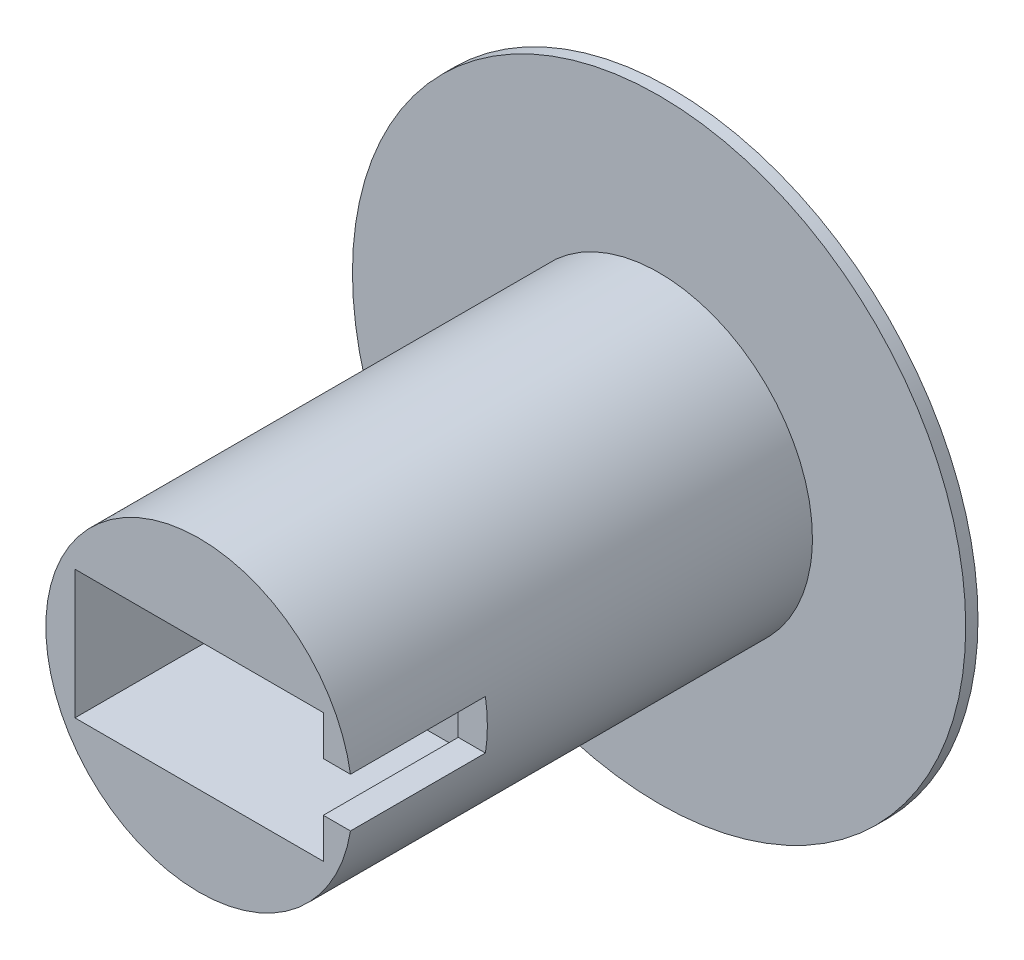
ISO-10303-21;
HEADER;
FILE_DESCRIPTION(('STEP AP214'),'2;1');
FILE_NAME('part.step','',(''),(''),'','','');
FILE_SCHEMA(('AUTOMOTIVE_DESIGN { 1 0 10303 214 1 1 1 1 }'));
ENDSEC;
DATA;
#1=APPLICATION_CONTEXT('core data for automotive mechanical design processes');
#2=APPLICATION_PROTOCOL_DEFINITION('international standard','automotive_design',2000,#1);
#3=PRODUCT_CONTEXT('',#1,'mechanical');
#4=PRODUCT('Part','Part','',(#3));
#5=PRODUCT_RELATED_PRODUCT_CATEGORY('part','',(#4));
#6=PRODUCT_DEFINITION_FORMATION('','',#4);
#7=PRODUCT_DEFINITION_CONTEXT('part definition',#1,'design');
#8=PRODUCT_DEFINITION('design','',#6,#7);
#9=PRODUCT_DEFINITION_SHAPE('','',#8);
#10=(LENGTH_UNIT() NAMED_UNIT(*) SI_UNIT(.MILLI.,.METRE.));
#11=(NAMED_UNIT(*) PLANE_ANGLE_UNIT() SI_UNIT($,.RADIAN.));
#12=(NAMED_UNIT(*) SI_UNIT($,.STERADIAN.) SOLID_ANGLE_UNIT());
#13=UNCERTAINTY_MEASURE_WITH_UNIT(LENGTH_MEASURE(1.E-05),#10,'distance_accuracy_value','');
#14=(GEOMETRIC_REPRESENTATION_CONTEXT(3) GLOBAL_UNCERTAINTY_ASSIGNED_CONTEXT((#13)) GLOBAL_UNIT_ASSIGNED_CONTEXT((#10,
#11,#12)) REPRESENTATION_CONTEXT('',''));
#15=CARTESIAN_POINT('',(0.,0.,0.));
#16=DIRECTION('',(0.,0.,1.));
#17=DIRECTION('',(1.,0.,0.));
#18=AXIS2_PLACEMENT_3D('',#15,#16,#17);
#19=CARTESIAN_POINT('',(0.,0.,2.));
#20=DIRECTION('',(0.,0.,-1.));
#21=DIRECTION('',(-1.,0.,0.));
#22=AXIS2_PLACEMENT_3D('',#19,#20,#21);
#23=CYLINDRICAL_SURFACE('',#22,50.);
#24=CARTESIAN_POINT('',(0.,0.,2.));
#25=DIRECTION('',(0.,0.,1.));
#26=DIRECTION('',(1.,0.,0.));
#27=AXIS2_PLACEMENT_3D('',#24,#25,#26);
#28=CIRCLE('',#27,50.);
#29=CARTESIAN_POINT('',(50.,0.,2.));
#30=VERTEX_POINT('',#29);
#31=EDGE_CURVE('E11',#30,#30,#28,.T.);
#32=ORIENTED_EDGE('',*,*,#31,.F.);
#33=EDGE_LOOP('',(#32));
#34=FACE_BOUND('',#33,.T.);
#35=CARTESIAN_POINT('',(0.,0.,0.));
#36=DIRECTION('',(0.,0.,1.));
#37=DIRECTION('',(1.,0.,0.));
#38=AXIS2_PLACEMENT_3D('',#35,#36,#37);
#39=CIRCLE('',#38,50.);
#40=CARTESIAN_POINT('',(50.,0.,0.));
#41=VERTEX_POINT('',#40);
#42=EDGE_CURVE('E43',#41,#41,#39,.T.);
#43=ORIENTED_EDGE('',*,*,#42,.T.);
#44=EDGE_LOOP('',(#43));
#45=FACE_BOUND('',#44,.T.);
#46=ADVANCED_FACE('F40',(#34,#45),#23,.T.);
#47=CARTESIAN_POINT('',(0.,0.,2.));
#48=DIRECTION('',(0.,0.,1.));
#49=DIRECTION('',(1.,0.,0.));
#50=AXIS2_PLACEMENT_3D('',#47,#48,#49);
#51=PLANE('',#50);
#52=CARTESIAN_POINT('',(0.,0.,2.));
#53=DIRECTION('',(0.,0.,1.));
#54=DIRECTION('',(1.,0.,0.));
#55=AXIS2_PLACEMENT_3D('',#52,#53,#54);
#56=CIRCLE('',#55,25.);
#57=CARTESIAN_POINT('',(25.,0.,2.));
#58=VERTEX_POINT('',#57);
#59=EDGE_CURVE('E48',#58,#58,#56,.T.);
#60=ORIENTED_EDGE('',*,*,#59,.F.);
#61=EDGE_LOOP('',(#60));
#62=FACE_BOUND('',#61,.T.);
#63=ORIENTED_EDGE('',*,*,#31,.T.);
#64=EDGE_LOOP('',(#63));
#65=FACE_BOUND('',#64,.T.);
#66=ADVANCED_FACE('F134',(#62,#65),#51,.T.);
#67=CARTESIAN_POINT('',(0.,0.,0.));
#68=DIRECTION('',(0.,0.,1.));
#69=DIRECTION('',(1.,0.,0.));
#70=AXIS2_PLACEMENT_3D('',#67,#68,#69);
#71=PLANE('',#70);
#72=ORIENTED_EDGE('',*,*,#42,.F.);
#73=EDGE_LOOP('',(#72));
#74=FACE_BOUND('',#73,.T.);
#75=ADVANCED_FACE('F137',(#74),#71,.F.);
#76=CARTESIAN_POINT('',(0.,4.,77.));
#77=DIRECTION('',(0.,1.,0.));
#78=DIRECTION('',(0.,0.,1.));
#79=AXIS2_PLACEMENT_3D('',#76,#77,#78);
#80=PLANE('',#79);
#81=DIRECTION('',(0.,0.,-1.));
#82=VECTOR('',#81,1.);
#83=CARTESIAN_POINT('',(20.25,4.,77.));
#84=LINE('',#83,#82);
#85=CARTESIAN_POINT('',(20.25,4.,77.));
#86=VERTEX_POINT('',#85);
#87=CARTESIAN_POINT('',(20.25,4.,55.));
#88=VERTEX_POINT('',#87);
#89=EDGE_CURVE('E213',#86,#88,#84,.T.);
#90=ORIENTED_EDGE('',*,*,#89,.T.);
#91=DIRECTION('',(1.,0.,0.));
#92=VECTOR('',#91,1.);
#93=CARTESIAN_POINT('',(0.,4.,55.));
#94=LINE('',#93,#92);
#95=CARTESIAN_POINT('',(24.6779253585061,4.,55.));
#96=VERTEX_POINT('',#95);
#97=EDGE_CURVE('E55',#88,#96,#94,.T.);
#98=ORIENTED_EDGE('',*,*,#97,.T.);
#99=DIRECTION('',(0.,0.,-1.));
#100=VECTOR('',#99,1.);
#101=CARTESIAN_POINT('',(24.6779253585061,4.,77.));
#102=LINE('',#101,#100);
#103=CARTESIAN_POINT('',(24.6779253585061,4.,77.));
#104=VERTEX_POINT('',#103);
#105=EDGE_CURVE('E109',#104,#96,#102,.T.);
#106=ORIENTED_EDGE('',*,*,#105,.F.);
#107=DIRECTION('',(1.,0.,0.));
#108=VECTOR('',#107,1.);
#109=CARTESIAN_POINT('',(0.,4.,77.));
#110=LINE('',#109,#108);
#111=EDGE_CURVE('E114',#86,#104,#110,.T.);
#112=ORIENTED_EDGE('',*,*,#111,.F.);
#113=EDGE_LOOP('',(#90,#98,#106,#112));
#114=FACE_BOUND('',#113,.T.);
#115=ADVANCED_FACE('F123',(#114),#80,.F.);
#116=CARTESIAN_POINT('',(0.,0.,77.));
#117=DIRECTION('',(0.,0.,-1.));
#118=DIRECTION('',(-1.,0.,0.));
#119=AXIS2_PLACEMENT_3D('',#116,#117,#118);
#120=CYLINDRICAL_SURFACE('',#119,25.);
#121=ORIENTED_EDGE('',*,*,#59,.T.);
#122=EDGE_LOOP('',(#121));
#123=FACE_BOUND('',#122,.T.);
#124=ORIENTED_EDGE('',*,*,#105,.T.);
#125=CARTESIAN_POINT('',(0.,0.,55.));
#126=DIRECTION('',(0.,0.,1.));
#127=DIRECTION('',(1.,0.,0.));
#128=AXIS2_PLACEMENT_3D('',#125,#126,#127);
#129=CIRCLE('',#128,25.);
#130=CARTESIAN_POINT('',(24.6779253585061,-4.,55.));
#131=VERTEX_POINT('',#130);
#132=EDGE_CURVE('E183',#131,#96,#129,.T.);
#133=ORIENTED_EDGE('',*,*,#132,.F.);
#134=DIRECTION('',(0.,0.,-1.));
#135=VECTOR('',#134,1.);
#136=CARTESIAN_POINT('',(24.6779253585061,-4.,77.));
#137=LINE('',#136,#135);
#138=CARTESIAN_POINT('',(24.6779253585061,-4.,77.));
#139=VERTEX_POINT('',#138);
#140=EDGE_CURVE('E63',#139,#131,#137,.T.);
#141=ORIENTED_EDGE('',*,*,#140,.F.);
#142=CARTESIAN_POINT('',(0.,0.,77.));
#143=DIRECTION('',(0.,0.,1.));
#144=DIRECTION('',(1.,0.,0.));
#145=AXIS2_PLACEMENT_3D('',#142,#143,#144);
#146=CIRCLE('',#145,25.);
#147=EDGE_CURVE('E105',#104,#139,#146,.T.);
#148=ORIENTED_EDGE('',*,*,#147,.F.);
#149=EDGE_LOOP('',(#124,#133,#141,#148));
#150=FACE_BOUND('',#149,.T.);
#151=ADVANCED_FACE('F107',(#123,#150),#120,.T.);
#152=CARTESIAN_POINT('',(0.,-4.,77.));
#153=DIRECTION('',(0.,1.,0.));
#154=DIRECTION('',(0.,0.,1.));
#155=AXIS2_PLACEMENT_3D('',#152,#153,#154);
#156=PLANE('',#155);
#157=DIRECTION('',(1.,0.,0.));
#158=VECTOR('',#157,1.);
#159=CARTESIAN_POINT('',(0.,-4.,55.));
#160=LINE('',#159,#158);
#161=CARTESIAN_POINT('',(20.25,-4.,55.));
#162=VERTEX_POINT('',#161);
#163=EDGE_CURVE('E185',#162,#131,#160,.T.);
#164=ORIENTED_EDGE('',*,*,#163,.F.);
#165=DIRECTION('',(0.,0.,-1.));
#166=VECTOR('',#165,1.);
#167=CARTESIAN_POINT('',(20.25,-4.,77.));
#168=LINE('',#167,#166);
#169=CARTESIAN_POINT('',(20.25,-4.,77.));
#170=VERTEX_POINT('',#169);
#171=EDGE_CURVE('E126',#170,#162,#168,.T.);
#172=ORIENTED_EDGE('',*,*,#171,.F.);
#173=DIRECTION('',(1.,0.,0.));
#174=VECTOR('',#173,1.);
#175=CARTESIAN_POINT('',(0.,-4.,77.));
#176=LINE('',#175,#174);
#177=EDGE_CURVE('E113',#170,#139,#176,.T.);
#178=ORIENTED_EDGE('',*,*,#177,.T.);
#179=ORIENTED_EDGE('',*,*,#140,.T.);
#180=EDGE_LOOP('',(#164,#172,#178,#179));
#181=FACE_BOUND('',#180,.T.);
#182=ADVANCED_FACE('F153',(#181),#156,.T.);
#183=CARTESIAN_POINT('',(20.25,0.,77.));
#184=DIRECTION('',(1.,0.,0.));
#185=DIRECTION('',(0.,0.,-1.));
#186=AXIS2_PLACEMENT_3D('',#183,#184,#185);
#187=PLANE('',#186);
#188=ORIENTED_EDGE('',*,*,#171,.T.);
#189=DIRECTION('',(0.,-1.,0.));
#190=VECTOR('',#189,1.);
#191=CARTESIAN_POINT('',(20.25,0.,55.));
#192=LINE('',#191,#190);
#193=EDGE_CURVE('E187',#88,#162,#192,.T.);
#194=ORIENTED_EDGE('',*,*,#193,.F.);
#195=ORIENTED_EDGE('',*,*,#89,.F.);
#196=DIRECTION('',(0.,-1.,0.));
#197=VECTOR('',#196,1.);
#198=CARTESIAN_POINT('',(20.25,0.,77.));
#199=LINE('',#198,#197);
#200=CARTESIAN_POINT('',(20.25,10.5,77.));
#201=VERTEX_POINT('',#200);
#202=EDGE_CURVE('E119',#201,#86,#199,.T.);
#203=ORIENTED_EDGE('',*,*,#202,.F.);
#204=DIRECTION('',(0.,0.,-1.));
#205=VECTOR('',#204,1.);
#206=CARTESIAN_POINT('',(20.25,10.5,77.));
#207=LINE('',#206,#205);
#208=CARTESIAN_POINT('',(20.25,10.5,50.));
#209=VERTEX_POINT('',#208);
#210=EDGE_CURVE('E215',#201,#209,#207,.T.);
#211=ORIENTED_EDGE('',*,*,#210,.T.);
#212=DIRECTION('',(0.,-1.,0.));
#213=VECTOR('',#212,1.);
#214=CARTESIAN_POINT('',(20.25,0.,50.));
#215=LINE('',#214,#213);
#216=CARTESIAN_POINT('',(20.25,-10.5,50.));
#217=VERTEX_POINT('',#216);
#218=EDGE_CURVE('E195',#209,#217,#215,.T.);
#219=ORIENTED_EDGE('',*,*,#218,.T.);
#220=DIRECTION('',(0.,0.,-1.));
#221=VECTOR('',#220,1.);
#222=CARTESIAN_POINT('',(20.25,-10.5,77.));
#223=LINE('',#222,#221);
#224=CARTESIAN_POINT('',(20.25,-10.5,77.));
#225=VERTEX_POINT('',#224);
#226=EDGE_CURVE('E224',#225,#217,#223,.T.);
#227=ORIENTED_EDGE('',*,*,#226,.F.);
#228=EDGE_CURVE('E203',#170,#225,#199,.T.);
#229=ORIENTED_EDGE('',*,*,#228,.F.);
#230=EDGE_LOOP('',(#188,#194,#195,#203,#211,#219,#227,#229));
#231=FACE_BOUND('',#230,.T.);
#232=ADVANCED_FACE('F156',(#231),#187,.F.);
#233=CARTESIAN_POINT('',(0.,-10.5,77.));
#234=DIRECTION('',(0.,1.,0.));
#235=DIRECTION('',(0.,0.,1.));
#236=AXIS2_PLACEMENT_3D('',#233,#234,#235);
#237=PLANE('',#236);
#238=DIRECTION('',(1.,0.,0.));
#239=VECTOR('',#238,1.);
#240=CARTESIAN_POINT('',(0.,-10.5,50.));
#241=LINE('',#240,#239);
#242=CARTESIAN_POINT('',(-20.25,-10.5,50.));
#243=VERTEX_POINT('',#242);
#244=EDGE_CURVE('E192',#243,#217,#241,.T.);
#245=ORIENTED_EDGE('',*,*,#244,.F.);
#246=DIRECTION('',(0.,0.,-1.));
#247=VECTOR('',#246,1.);
#248=CARTESIAN_POINT('',(-20.25,-10.5,77.));
#249=LINE('',#248,#247);
#250=CARTESIAN_POINT('',(-20.25,-10.5,77.));
#251=VERTEX_POINT('',#250);
#252=EDGE_CURVE('E221',#251,#243,#249,.T.);
#253=ORIENTED_EDGE('',*,*,#252,.F.);
#254=DIRECTION('',(1.,0.,0.));
#255=VECTOR('',#254,1.);
#256=CARTESIAN_POINT('',(0.,-10.5,77.));
#257=LINE('',#256,#255);
#258=EDGE_CURVE('E205',#251,#225,#257,.T.);
#259=ORIENTED_EDGE('',*,*,#258,.T.);
#260=ORIENTED_EDGE('',*,*,#226,.T.);
#261=EDGE_LOOP('',(#245,#253,#259,#260));
#262=FACE_BOUND('',#261,.T.);
#263=ADVANCED_FACE('F157',(#262),#237,.T.);
#264=CARTESIAN_POINT('',(-20.25,0.,77.));
#265=DIRECTION('',(1.,0.,0.));
#266=DIRECTION('',(0.,0.,-1.));
#267=AXIS2_PLACEMENT_3D('',#264,#265,#266);
#268=PLANE('',#267);
#269=DIRECTION('',(0.,-1.,0.));
#270=VECTOR('',#269,1.);
#271=CARTESIAN_POINT('',(-20.25,0.,50.));
#272=LINE('',#271,#270);
#273=CARTESIAN_POINT('',(-20.25,10.5,50.));
#274=VERTEX_POINT('',#273);
#275=EDGE_CURVE('E121',#274,#243,#272,.T.);
#276=ORIENTED_EDGE('',*,*,#275,.F.);
#277=DIRECTION('',(0.,0.,-1.));
#278=VECTOR('',#277,1.);
#279=CARTESIAN_POINT('',(-20.25,10.5,77.));
#280=LINE('',#279,#278);
#281=CARTESIAN_POINT('',(-20.25,10.5,77.));
#282=VERTEX_POINT('',#281);
#283=EDGE_CURVE('E218',#282,#274,#280,.T.);
#284=ORIENTED_EDGE('',*,*,#283,.F.);
#285=DIRECTION('',(0.,-1.,0.));
#286=VECTOR('',#285,1.);
#287=CARTESIAN_POINT('',(-20.25,0.,77.));
#288=LINE('',#287,#286);
#289=EDGE_CURVE('E208',#282,#251,#288,.T.);
#290=ORIENTED_EDGE('',*,*,#289,.T.);
#291=ORIENTED_EDGE('',*,*,#252,.T.);
#292=EDGE_LOOP('',(#276,#284,#290,#291));
#293=FACE_BOUND('',#292,.T.);
#294=ADVANCED_FACE('F160',(#293),#268,.T.);
#295=CARTESIAN_POINT('',(0.,10.5,77.));
#296=DIRECTION('',(0.,1.,0.));
#297=DIRECTION('',(0.,0.,1.));
#298=AXIS2_PLACEMENT_3D('',#295,#296,#297);
#299=PLANE('',#298);
#300=ORIENTED_EDGE('',*,*,#283,.T.);
#301=DIRECTION('',(1.,0.,0.));
#302=VECTOR('',#301,1.);
#303=CARTESIAN_POINT('',(0.,10.5,50.));
#304=LINE('',#303,#302);
#305=EDGE_CURVE('E197',#274,#209,#304,.T.);
#306=ORIENTED_EDGE('',*,*,#305,.T.);
#307=ORIENTED_EDGE('',*,*,#210,.F.);
#308=DIRECTION('',(1.,0.,0.));
#309=VECTOR('',#308,1.);
#310=CARTESIAN_POINT('',(0.,10.5,77.));
#311=LINE('',#310,#309);
#312=EDGE_CURVE('E211',#282,#201,#311,.T.);
#313=ORIENTED_EDGE('',*,*,#312,.F.);
#314=EDGE_LOOP('',(#300,#306,#307,#313));
#315=FACE_BOUND('',#314,.T.);
#316=ADVANCED_FACE('F164',(#315),#299,.F.);
#317=CARTESIAN_POINT('',(0.,0.,77.));
#318=DIRECTION('',(0.,0.,1.));
#319=DIRECTION('',(1.,0.,0.));
#320=AXIS2_PLACEMENT_3D('',#317,#318,#319);
#321=PLANE('',#320);
#322=ORIENTED_EDGE('',*,*,#111,.T.);
#323=ORIENTED_EDGE('',*,*,#147,.T.);
#324=ORIENTED_EDGE('',*,*,#177,.F.);
#325=ORIENTED_EDGE('',*,*,#228,.T.);
#326=ORIENTED_EDGE('',*,*,#258,.F.);
#327=ORIENTED_EDGE('',*,*,#289,.F.);
#328=ORIENTED_EDGE('',*,*,#312,.T.);
#329=ORIENTED_EDGE('',*,*,#202,.T.);
#330=EDGE_LOOP('',(#322,#323,#324,#325,#326,#327,#328,#329));
#331=FACE_BOUND('',#330,.T.);
#332=ADVANCED_FACE('F117',(#331),#321,.T.);
#333=CARTESIAN_POINT('',(0.,0.,50.));
#334=DIRECTION('',(0.,0.,1.));
#335=DIRECTION('',(1.,0.,0.));
#336=AXIS2_PLACEMENT_3D('',#333,#334,#335);
#337=PLANE('',#336);
#338=ORIENTED_EDGE('',*,*,#244,.T.);
#339=ORIENTED_EDGE('',*,*,#218,.F.);
#340=ORIENTED_EDGE('',*,*,#305,.F.);
#341=ORIENTED_EDGE('',*,*,#275,.T.);
#342=EDGE_LOOP('',(#338,#339,#340,#341));
#343=FACE_BOUND('',#342,.T.);
#344=ADVANCED_FACE('F174',(#343),#337,.T.);
#345=CARTESIAN_POINT('',(0.,0.,55.));
#346=DIRECTION('',(0.,0.,1.));
#347=DIRECTION('',(1.,0.,0.));
#348=AXIS2_PLACEMENT_3D('',#345,#346,#347);
#349=PLANE('',#348);
#350=ORIENTED_EDGE('',*,*,#132,.T.);
#351=ORIENTED_EDGE('',*,*,#97,.F.);
#352=ORIENTED_EDGE('',*,*,#193,.T.);
#353=ORIENTED_EDGE('',*,*,#163,.T.);
#354=EDGE_LOOP('',(#350,#351,#352,#353));
#355=FACE_BOUND('',#354,.T.);
#356=ADVANCED_FACE('F177',(#355),#349,.T.);
#357=CLOSED_SHELL('',(#46,#66,#75,#115,#151,#182,#232,#263,#294,#316,#332,#344,#356));
#358=MANIFOLD_SOLID_BREP('B2',#357);
#359=ADVANCED_BREP_SHAPE_REPRESENTATION('',(#18,#358),#14);
#360=SHAPE_DEFINITION_REPRESENTATION(#9,#359);
ENDSEC;
END-ISO-10303-21;
